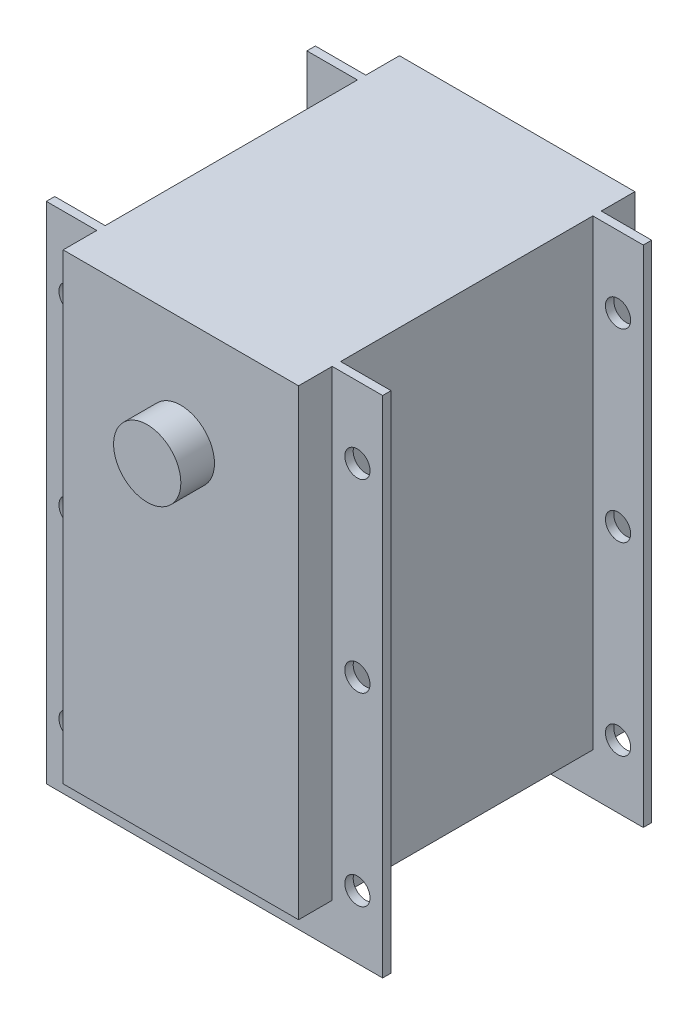
ISO-10303-21;
HEADER;
FILE_DESCRIPTION(('STEP AP214'),'2;1');
FILE_NAME('part.step','',(''),(''),'','','');
FILE_SCHEMA(('AUTOMOTIVE_DESIGN { 1 0 10303 214 1 1 1 1 }'));
ENDSEC;
DATA;
#1=APPLICATION_CONTEXT('core data for automotive mechanical design processes');
#2=APPLICATION_PROTOCOL_DEFINITION('international standard','automotive_design',2000,#1);
#3=PRODUCT_CONTEXT('',#1,'mechanical');
#4=PRODUCT('Part','Part','',(#3));
#5=PRODUCT_RELATED_PRODUCT_CATEGORY('part','',(#4));
#6=PRODUCT_DEFINITION_FORMATION('','',#4);
#7=PRODUCT_DEFINITION_CONTEXT('part definition',#1,'design');
#8=PRODUCT_DEFINITION('design','',#6,#7);
#9=PRODUCT_DEFINITION_SHAPE('','',#8);
#10=(LENGTH_UNIT() NAMED_UNIT(*) SI_UNIT(.MILLI.,.METRE.));
#11=(NAMED_UNIT(*) PLANE_ANGLE_UNIT() SI_UNIT($,.RADIAN.));
#12=(NAMED_UNIT(*) SI_UNIT($,.STERADIAN.) SOLID_ANGLE_UNIT());
#13=UNCERTAINTY_MEASURE_WITH_UNIT(LENGTH_MEASURE(1.E-05),#10,'distance_accuracy_value','');
#14=(GEOMETRIC_REPRESENTATION_CONTEXT(3) GLOBAL_UNCERTAINTY_ASSIGNED_CONTEXT((#13)) GLOBAL_UNIT_ASSIGNED_CONTEXT((#10,
#11,#12)) REPRESENTATION_CONTEXT('',''));
#15=CARTESIAN_POINT('',(0.,0.,0.));
#16=DIRECTION('',(0.,0.,1.));
#17=DIRECTION('',(1.,0.,0.));
#18=AXIS2_PLACEMENT_3D('',#15,#16,#17);
#19=CARTESIAN_POINT('',(-14.00000006,27.5,40.));
#20=DIRECTION('',(1.,0.,0.));
#21=DIRECTION('',(0.,1.,0.));
#22=AXIS2_PLACEMENT_3D('',#19,#20,#21);
#23=PLANE('',#22);
#24=DIRECTION('',(0.,1.,0.));
#25=VECTOR('',#24,1.);
#26=CARTESIAN_POINT('',(-14.00000006,27.5,5.));
#27=LINE('',#26,#25);
#28=CARTESIAN_POINT('',(-14.00000006,-27.5,5.));
#29=VERTEX_POINT('',#28);
#30=CARTESIAN_POINT('',(-14.00000006,27.5,5.));
#31=VERTEX_POINT('',#30);
#32=EDGE_CURVE('E229',#29,#31,#27,.T.);
#33=ORIENTED_EDGE('',*,*,#32,.F.);
#34=DIRECTION('',(0.,0.,-1.));
#35=VECTOR('',#34,1.);
#36=CARTESIAN_POINT('',(-14.00000006,-27.5,40.));
#37=LINE('',#36,#35);
#38=CARTESIAN_POINT('',(-14.00000006,-27.5,35.));
#39=VERTEX_POINT('',#38);
#40=EDGE_CURVE('E316',#39,#29,#37,.T.);
#41=ORIENTED_EDGE('',*,*,#40,.F.);
#42=DIRECTION('',(0.,-1.,0.));
#43=VECTOR('',#42,1.);
#44=CARTESIAN_POINT('',(-14.00000006,27.5,35.));
#45=LINE('',#44,#43);
#46=CARTESIAN_POINT('',(-14.00000006,27.5,35.));
#47=VERTEX_POINT('',#46);
#48=EDGE_CURVE('E275',#47,#39,#45,.T.);
#49=ORIENTED_EDGE('',*,*,#48,.F.);
#50=DIRECTION('',(0.,0.,-1.));
#51=VECTOR('',#50,1.);
#52=CARTESIAN_POINT('',(-14.00000006,27.5,40.));
#53=LINE('',#52,#51);
#54=EDGE_CURVE('E303',#47,#31,#53,.T.);
#55=ORIENTED_EDGE('',*,*,#54,.T.);
#56=EDGE_LOOP('',(#33,#41,#49,#55));
#57=FACE_BOUND('',#56,.T.);
#58=ADVANCED_FACE('F33',(#57),#23,.F.);
#59=CARTESIAN_POINT('',(-14.00000006,-27.5,40.));
#60=DIRECTION('',(0.,1.,0.));
#61=DIRECTION('',(0.,0.,1.));
#62=AXIS2_PLACEMENT_3D('',#59,#60,#61);
#63=PLANE('',#62);
#64=DIRECTION('',(-1.,0.,0.));
#65=VECTOR('',#64,1.);
#66=CARTESIAN_POINT('',(-14.00000006,-27.5,5.));
#67=LINE('',#66,#65);
#68=CARTESIAN_POINT('',(13.99999994,-27.5,5.));
#69=VERTEX_POINT('',#68);
#70=EDGE_CURVE('E227',#69,#29,#67,.T.);
#71=ORIENTED_EDGE('',*,*,#70,.F.);
#72=DIRECTION('',(0.,0.,-1.));
#73=VECTOR('',#72,1.);
#74=CARTESIAN_POINT('',(13.99999994,-27.5,40.));
#75=LINE('',#74,#73);
#76=CARTESIAN_POINT('',(13.99999994,-27.5,35.));
#77=VERTEX_POINT('',#76);
#78=EDGE_CURVE('E313',#77,#69,#75,.T.);
#79=ORIENTED_EDGE('',*,*,#78,.F.);
#80=DIRECTION('',(1.,0.,0.));
#81=VECTOR('',#80,1.);
#82=CARTESIAN_POINT('',(-14.00000006,-27.5,35.));
#83=LINE('',#82,#81);
#84=EDGE_CURVE('E273',#39,#77,#83,.T.);
#85=ORIENTED_EDGE('',*,*,#84,.F.);
#86=ORIENTED_EDGE('',*,*,#40,.T.);
#87=EDGE_LOOP('',(#71,#79,#85,#86));
#88=FACE_BOUND('',#87,.T.);
#89=ADVANCED_FACE('F416',(#88),#63,.F.);
#90=CARTESIAN_POINT('',(13.99999994,27.5,40.));
#91=DIRECTION('',(-1.,0.,0.));
#92=DIRECTION('',(0.,-1.,0.));
#93=AXIS2_PLACEMENT_3D('',#90,#91,#92);
#94=PLANE('',#93);
#95=DIRECTION('',(0.,-1.,0.));
#96=VECTOR('',#95,1.);
#97=CARTESIAN_POINT('',(13.99999994,27.5,5.));
#98=LINE('',#97,#96);
#99=CARTESIAN_POINT('',(13.99999994,27.5,5.));
#100=VERTEX_POINT('',#99);
#101=EDGE_CURVE('E225',#100,#69,#98,.T.);
#102=ORIENTED_EDGE('',*,*,#101,.F.);
#103=DIRECTION('',(0.,0.,-1.));
#104=VECTOR('',#103,1.);
#105=CARTESIAN_POINT('',(13.99999994,27.5,40.));
#106=LINE('',#105,#104);
#107=CARTESIAN_POINT('',(13.99999994,27.5,35.));
#108=VERTEX_POINT('',#107);
#109=EDGE_CURVE('E308',#108,#100,#106,.T.);
#110=ORIENTED_EDGE('',*,*,#109,.F.);
#111=DIRECTION('',(0.,1.,0.));
#112=VECTOR('',#111,1.);
#113=CARTESIAN_POINT('',(13.99999994,27.5,35.));
#114=LINE('',#113,#112);
#115=EDGE_CURVE('E271',#77,#108,#114,.T.);
#116=ORIENTED_EDGE('',*,*,#115,.F.);
#117=ORIENTED_EDGE('',*,*,#78,.T.);
#118=EDGE_LOOP('',(#102,#110,#116,#117));
#119=FACE_BOUND('',#118,.T.);
#120=ADVANCED_FACE('F422',(#119),#94,.F.);
#121=CARTESIAN_POINT('',(-14.00000006,-27.5,4.));
#122=VERTEX_POINT('',#121);
#123=CARTESIAN_POINT('',(-14.00000006,-27.5,0.));
#124=VERTEX_POINT('',#123);
#125=EDGE_CURVE('E312',#122,#124,#37,.T.);
#126=ORIENTED_EDGE('',*,*,#125,.F.);
#127=DIRECTION('',(0.,1.,0.));
#128=VECTOR('',#127,1.);
#129=CARTESIAN_POINT('',(-14.00000006,27.5,4.));
#130=LINE('',#129,#128);
#131=CARTESIAN_POINT('',(-14.00000006,27.5,4.));
#132=VERTEX_POINT('',#131);
#133=EDGE_CURVE('E222',#122,#132,#130,.T.);
#134=ORIENTED_EDGE('',*,*,#133,.T.);
#135=CARTESIAN_POINT('',(-14.00000006,27.5,0.));
#136=VERTEX_POINT('',#135);
#137=EDGE_CURVE('E288',#132,#136,#53,.T.);
#138=ORIENTED_EDGE('',*,*,#137,.T.);
#139=DIRECTION('',(0.,-1.,0.));
#140=VECTOR('',#139,1.);
#141=CARTESIAN_POINT('',(-14.00000006,27.5,0.));
#142=LINE('',#141,#140);
#143=EDGE_CURVE('E277',#136,#124,#142,.T.);
#144=ORIENTED_EDGE('',*,*,#143,.T.);
#145=EDGE_LOOP('',(#126,#134,#138,#144));
#146=FACE_BOUND('',#145,.T.);
#147=ADVANCED_FACE('F418',(#146),#23,.F.);
#148=CARTESIAN_POINT('',(13.99999994,-27.5,4.));
#149=VERTEX_POINT('',#148);
#150=CARTESIAN_POINT('',(13.99999994,-27.5,0.));
#151=VERTEX_POINT('',#150);
#152=EDGE_CURVE('E307',#149,#151,#75,.T.);
#153=ORIENTED_EDGE('',*,*,#152,.F.);
#154=DIRECTION('',(-1.,0.,0.));
#155=VECTOR('',#154,1.);
#156=CARTESIAN_POINT('',(-14.00000006,-27.5,4.));
#157=LINE('',#156,#155);
#158=EDGE_CURVE('E48',#149,#122,#157,.T.);
#159=ORIENTED_EDGE('',*,*,#158,.T.);
#160=ORIENTED_EDGE('',*,*,#125,.T.);
#161=DIRECTION('',(1.,0.,0.));
#162=VECTOR('',#161,1.);
#163=CARTESIAN_POINT('',(-14.00000006,-27.5,0.));
#164=LINE('',#163,#162);
#165=EDGE_CURVE('E291',#124,#151,#164,.T.);
#166=ORIENTED_EDGE('',*,*,#165,.T.);
#167=EDGE_LOOP('',(#153,#159,#160,#166));
#168=FACE_BOUND('',#167,.T.);
#169=ADVANCED_FACE('F424',(#168),#63,.F.);
#170=CARTESIAN_POINT('',(13.99999994,27.5,4.));
#171=VERTEX_POINT('',#170);
#172=CARTESIAN_POINT('',(13.99999994,27.5,0.));
#173=VERTEX_POINT('',#172);
#174=EDGE_CURVE('E302',#171,#173,#106,.T.);
#175=ORIENTED_EDGE('',*,*,#174,.F.);
#176=DIRECTION('',(0.,-1.,0.));
#177=VECTOR('',#176,1.);
#178=CARTESIAN_POINT('',(13.99999994,27.5,4.));
#179=LINE('',#178,#177);
#180=EDGE_CURVE('E216',#171,#149,#179,.T.);
#181=ORIENTED_EDGE('',*,*,#180,.T.);
#182=ORIENTED_EDGE('',*,*,#152,.T.);
#183=DIRECTION('',(0.,1.,0.));
#184=VECTOR('',#183,1.);
#185=CARTESIAN_POINT('',(13.99999994,27.5,0.));
#186=LINE('',#185,#184);
#187=EDGE_CURVE('E294',#151,#173,#186,.T.);
#188=ORIENTED_EDGE('',*,*,#187,.T.);
#189=EDGE_LOOP('',(#175,#181,#182,#188));
#190=FACE_BOUND('',#189,.T.);
#191=ADVANCED_FACE('F430',(#190),#94,.F.);
#192=CARTESIAN_POINT('',(-14.00000006,27.5,40.));
#193=VERTEX_POINT('',#192);
#194=CARTESIAN_POINT('',(-14.00000006,27.5,36.));
#195=VERTEX_POINT('',#194);
#196=EDGE_CURVE('E299',#193,#195,#53,.T.);
#197=ORIENTED_EDGE('',*,*,#196,.T.);
#198=DIRECTION('',(0.,-1.,0.));
#199=VECTOR('',#198,1.);
#200=CARTESIAN_POINT('',(-14.00000006,27.5,36.));
#201=LINE('',#200,#199);
#202=CARTESIAN_POINT('',(-14.00000006,-27.5,36.));
#203=VERTEX_POINT('',#202);
#204=EDGE_CURVE('E268',#195,#203,#201,.T.);
#205=ORIENTED_EDGE('',*,*,#204,.T.);
#206=CARTESIAN_POINT('',(-14.00000006,-27.5,40.));
#207=VERTEX_POINT('',#206);
#208=EDGE_CURVE('E41',#207,#203,#37,.T.);
#209=ORIENTED_EDGE('',*,*,#208,.F.);
#210=DIRECTION('',(0.,-1.,0.));
#211=VECTOR('',#210,1.);
#212=CARTESIAN_POINT('',(-14.00000006,27.5,40.));
#213=LINE('',#212,#211);
#214=EDGE_CURVE('E278',#193,#207,#213,.T.);
#215=ORIENTED_EDGE('',*,*,#214,.F.);
#216=EDGE_LOOP('',(#197,#205,#209,#215));
#217=FACE_BOUND('',#216,.T.);
#218=ADVANCED_FACE('F35',(#217),#23,.F.);
#219=ORIENTED_EDGE('',*,*,#208,.T.);
#220=DIRECTION('',(1.,0.,0.));
#221=VECTOR('',#220,1.);
#222=CARTESIAN_POINT('',(-14.00000006,-27.5,36.));
#223=LINE('',#222,#221);
#224=CARTESIAN_POINT('',(13.99999994,-27.5,36.));
#225=VERTEX_POINT('',#224);
#226=EDGE_CURVE('E265',#203,#225,#223,.T.);
#227=ORIENTED_EDGE('',*,*,#226,.T.);
#228=CARTESIAN_POINT('',(13.99999994,-27.5,40.));
#229=VERTEX_POINT('',#228);
#230=EDGE_CURVE('E309',#229,#225,#75,.T.);
#231=ORIENTED_EDGE('',*,*,#230,.F.);
#232=DIRECTION('',(1.,0.,0.));
#233=VECTOR('',#232,1.);
#234=CARTESIAN_POINT('',(-14.00000006,-27.5,40.));
#235=LINE('',#234,#233);
#236=EDGE_CURVE('E281',#207,#229,#235,.T.);
#237=ORIENTED_EDGE('',*,*,#236,.F.);
#238=EDGE_LOOP('',(#219,#227,#231,#237));
#239=FACE_BOUND('',#238,.T.);
#240=ADVANCED_FACE('F425',(#239),#63,.F.);
#241=ORIENTED_EDGE('',*,*,#230,.T.);
#242=DIRECTION('',(0.,1.,0.));
#243=VECTOR('',#242,1.);
#244=CARTESIAN_POINT('',(13.99999994,27.5,36.));
#245=LINE('',#244,#243);
#246=CARTESIAN_POINT('',(13.99999994,27.5,36.));
#247=VERTEX_POINT('',#246);
#248=EDGE_CURVE('E258',#225,#247,#245,.T.);
#249=ORIENTED_EDGE('',*,*,#248,.T.);
#250=CARTESIAN_POINT('',(13.99999994,27.5,40.));
#251=VERTEX_POINT('',#250);
#252=EDGE_CURVE('E304',#251,#247,#106,.T.);
#253=ORIENTED_EDGE('',*,*,#252,.F.);
#254=DIRECTION('',(0.,1.,0.));
#255=VECTOR('',#254,1.);
#256=CARTESIAN_POINT('',(13.99999994,27.5,40.));
#257=LINE('',#256,#255);
#258=EDGE_CURVE('E284',#229,#251,#257,.T.);
#259=ORIENTED_EDGE('',*,*,#258,.F.);
#260=EDGE_LOOP('',(#241,#249,#253,#259));
#261=FACE_BOUND('',#260,.T.);
#262=ADVANCED_FACE('F436',(#261),#94,.F.);
#263=CARTESIAN_POINT('',(-14.00000006,27.5,40.));
#264=DIRECTION('',(0.,-1.,0.));
#265=DIRECTION('',(0.,0.,-1.));
#266=AXIS2_PLACEMENT_3D('',#263,#264,#265);
#267=PLANE('',#266);
#268=ORIENTED_EDGE('',*,*,#137,.F.);
#269=DIRECTION('',(1.,0.,0.));
#270=VECTOR('',#269,1.);
#271=CARTESIAN_POINT('',(20.,27.5,4.));
#272=LINE('',#271,#270);
#273=CARTESIAN_POINT('',(-20.,27.5,4.));
#274=VERTEX_POINT('',#273);
#275=EDGE_CURVE('E197',#274,#132,#272,.T.);
#276=ORIENTED_EDGE('',*,*,#275,.F.);
#277=DIRECTION('',(0.,0.,-1.));
#278=VECTOR('',#277,1.);
#279=CARTESIAN_POINT('',(-20.,27.5,5.));
#280=LINE('',#279,#278);
#281=CARTESIAN_POINT('',(-20.,27.5,5.));
#282=VERTEX_POINT('',#281);
#283=EDGE_CURVE('E217',#282,#274,#280,.T.);
#284=ORIENTED_EDGE('',*,*,#283,.F.);
#285=DIRECTION('',(1.,0.,0.));
#286=VECTOR('',#285,1.);
#287=CARTESIAN_POINT('',(20.,27.5,5.));
#288=LINE('',#287,#286);
#289=EDGE_CURVE('E182',#282,#31,#288,.T.);
#290=ORIENTED_EDGE('',*,*,#289,.T.);
#291=ORIENTED_EDGE('',*,*,#54,.F.);
#292=DIRECTION('',(-1.,0.,0.));
#293=VECTOR('',#292,1.);
#294=CARTESIAN_POINT('',(-20.,27.5,35.));
#295=LINE('',#294,#293);
#296=CARTESIAN_POINT('',(-20.,27.5,35.));
#297=VERTEX_POINT('',#296);
#298=EDGE_CURVE('E241',#47,#297,#295,.T.);
#299=ORIENTED_EDGE('',*,*,#298,.T.);
#300=DIRECTION('',(0.,0.,1.));
#301=VECTOR('',#300,1.);
#302=CARTESIAN_POINT('',(-20.,27.5,35.));
#303=LINE('',#302,#301);
#304=CARTESIAN_POINT('',(-20.,27.5,36.));
#305=VERTEX_POINT('',#304);
#306=EDGE_CURVE('E255',#297,#305,#303,.T.);
#307=ORIENTED_EDGE('',*,*,#306,.T.);
#308=DIRECTION('',(-1.,0.,0.));
#309=VECTOR('',#308,1.);
#310=CARTESIAN_POINT('',(-20.,27.5,36.));
#311=LINE('',#310,#309);
#312=EDGE_CURVE('E253',#195,#305,#311,.T.);
#313=ORIENTED_EDGE('',*,*,#312,.F.);
#314=ORIENTED_EDGE('',*,*,#196,.F.);
#315=DIRECTION('',(-1.,0.,0.));
#316=VECTOR('',#315,1.);
#317=CARTESIAN_POINT('',(-14.00000006,27.5,40.));
#318=LINE('',#317,#316);
#319=EDGE_CURVE('E286',#251,#193,#318,.T.);
#320=ORIENTED_EDGE('',*,*,#319,.F.);
#321=ORIENTED_EDGE('',*,*,#252,.T.);
#322=CARTESIAN_POINT('',(20.,27.5,36.));
#323=VERTEX_POINT('',#322);
#324=EDGE_CURVE('E56',#323,#247,#311,.T.);
#325=ORIENTED_EDGE('',*,*,#324,.F.);
#326=DIRECTION('',(0.,0.,1.));
#327=VECTOR('',#326,1.);
#328=CARTESIAN_POINT('',(20.,27.5,35.));
#329=LINE('',#328,#327);
#330=CARTESIAN_POINT('',(20.,27.5,35.));
#331=VERTEX_POINT('',#330);
#332=EDGE_CURVE('E259',#331,#323,#329,.T.);
#333=ORIENTED_EDGE('',*,*,#332,.F.);
#334=EDGE_CURVE('E242',#331,#108,#295,.T.);
#335=ORIENTED_EDGE('',*,*,#334,.T.);
#336=ORIENTED_EDGE('',*,*,#109,.T.);
#337=CARTESIAN_POINT('',(20.,27.5,5.));
#338=VERTEX_POINT('',#337);
#339=EDGE_CURVE('E206',#100,#338,#288,.T.);
#340=ORIENTED_EDGE('',*,*,#339,.T.);
#341=DIRECTION('',(0.,0.,-1.));
#342=VECTOR('',#341,1.);
#343=CARTESIAN_POINT('',(20.,27.5,5.));
#344=LINE('',#343,#342);
#345=CARTESIAN_POINT('',(20.,27.5,4.));
#346=VERTEX_POINT('',#345);
#347=EDGE_CURVE('E196',#338,#346,#344,.T.);
#348=ORIENTED_EDGE('',*,*,#347,.T.);
#349=EDGE_CURVE('E199',#171,#346,#272,.T.);
#350=ORIENTED_EDGE('',*,*,#349,.F.);
#351=ORIENTED_EDGE('',*,*,#174,.T.);
#352=DIRECTION('',(-1.,0.,0.));
#353=VECTOR('',#352,1.);
#354=CARTESIAN_POINT('',(-14.00000006,27.5,0.));
#355=LINE('',#354,#353);
#356=EDGE_CURVE('E282',#173,#136,#355,.T.);
#357=ORIENTED_EDGE('',*,*,#356,.T.);
#358=EDGE_LOOP('',(#268,#276,#284,#290,#291,#299,#307,#313,#314,#320,#321,#325,#333,#335,#336,
#340,#348,#350,#351,#357));
#359=FACE_BOUND('',#358,.T.);
#360=ADVANCED_FACE('F447',(#359),#267,.F.);
#361=CARTESIAN_POINT('',(0.,0.,40.));
#362=DIRECTION('',(0.,0.,1.));
#363=DIRECTION('',(1.,0.,0.));
#364=AXIS2_PLACEMENT_3D('',#361,#362,#363);
#365=PLANE('',#364);
#366=CARTESIAN_POINT('',(0.,14.5,40.));
#367=DIRECTION('',(0.,0.,1.));
#368=DIRECTION('',(1.,0.,0.));
#369=AXIS2_PLACEMENT_3D('',#366,#367,#368);
#370=CIRCLE('',#369,4.);
#371=CARTESIAN_POINT('',(4.,14.5,40.));
#372=VERTEX_POINT('',#371);
#373=EDGE_CURVE('E356',#372,#372,#370,.T.);
#374=ORIENTED_EDGE('',*,*,#373,.F.);
#375=EDGE_LOOP('',(#374));
#376=FACE_BOUND('',#375,.T.);
#377=ORIENTED_EDGE('',*,*,#214,.T.);
#378=ORIENTED_EDGE('',*,*,#236,.T.);
#379=ORIENTED_EDGE('',*,*,#258,.T.);
#380=ORIENTED_EDGE('',*,*,#319,.T.);
#381=EDGE_LOOP('',(#377,#378,#379,#380));
#382=FACE_BOUND('',#381,.T.);
#383=ADVANCED_FACE('F456',(#376,#382),#365,.T.);
#384=CARTESIAN_POINT('',(0.,0.,0.));
#385=DIRECTION('',(0.,0.,1.));
#386=DIRECTION('',(1.,0.,0.));
#387=AXIS2_PLACEMENT_3D('',#384,#385,#386);
#388=PLANE('',#387);
#389=CARTESIAN_POINT('',(0.,13.5,0.));
#390=DIRECTION('',(0.,0.,1.));
#391=DIRECTION('',(1.,0.,0.));
#392=AXIS2_PLACEMENT_3D('',#389,#390,#391);
#393=CIRCLE('',#392,3.5);
#394=CARTESIAN_POINT('',(3.5,13.5,0.));
#395=VERTEX_POINT('',#394);
#396=EDGE_CURVE('E11',#395,#395,#393,.F.);
#397=ORIENTED_EDGE('',*,*,#396,.F.);
#398=EDGE_LOOP('',(#397));
#399=FACE_BOUND('',#398,.T.);
#400=ORIENTED_EDGE('',*,*,#143,.F.);
#401=ORIENTED_EDGE('',*,*,#356,.F.);
#402=ORIENTED_EDGE('',*,*,#187,.F.);
#403=ORIENTED_EDGE('',*,*,#165,.F.);
#404=EDGE_LOOP('',(#400,#401,#402,#403));
#405=FACE_BOUND('',#404,.T.);
#406=ADVANCED_FACE('F458',(#399,#405),#388,.F.);
#407=CARTESIAN_POINT('',(0.,0.,35.));
#408=DIRECTION('',(0.,0.,1.));
#409=DIRECTION('',(1.,0.,0.));
#410=AXIS2_PLACEMENT_3D('',#407,#408,#409);
#411=PLANE('',#410);
#412=CARTESIAN_POINT('',(-17.,-25.,35.));
#413=DIRECTION('',(0.,0.,1.));
#414=DIRECTION('',(1.,0.,0.));
#415=AXIS2_PLACEMENT_3D('',#412,#413,#414);
#416=CIRCLE('',#415,1.5);
#417=CARTESIAN_POINT('',(-15.5,-25.,35.));
#418=VERTEX_POINT('',#417);
#419=EDGE_CURVE('E348',#418,#418,#416,.T.);
#420=ORIENTED_EDGE('',*,*,#419,.T.);
#421=EDGE_LOOP('',(#420));
#422=FACE_BOUND('',#421,.T.);
#423=CARTESIAN_POINT('',(17.,-25.000000066,35.));
#424=DIRECTION('',(0.,0.,1.));
#425=DIRECTION('',(1.,0.,0.));
#426=AXIS2_PLACEMENT_3D('',#423,#424,#425);
#427=CIRCLE('',#426,1.5);
#428=CARTESIAN_POINT('',(18.5,-25.000000066,35.));
#429=VERTEX_POINT('',#428);
#430=EDGE_CURVE('E366',#429,#429,#427,.T.);
#431=ORIENTED_EDGE('',*,*,#430,.T.);
#432=EDGE_LOOP('',(#431));
#433=FACE_BOUND('',#432,.T.);
#434=CARTESIAN_POINT('',(17.,-3.000000066,35.));
#435=DIRECTION('',(0.,0.,1.));
#436=DIRECTION('',(1.,0.,0.));
#437=AXIS2_PLACEMENT_3D('',#434,#435,#436);
#438=CIRCLE('',#437,1.5);
#439=CARTESIAN_POINT('',(18.5,-3.000000066,35.));
#440=VERTEX_POINT('',#439);
#441=EDGE_CURVE('E373',#440,#440,#438,.T.);
#442=ORIENTED_EDGE('',*,*,#441,.T.);
#443=EDGE_LOOP('',(#442));
#444=FACE_BOUND('',#443,.T.);
#445=CARTESIAN_POINT('',(-17.,-2.99999999999999,35.));
#446=DIRECTION('',(0.,0.,1.));
#447=DIRECTION('',(1.,0.,0.));
#448=AXIS2_PLACEMENT_3D('',#445,#446,#447);
#449=CIRCLE('',#448,1.5);
#450=CARTESIAN_POINT('',(-15.5,-2.99999999999999,35.));
#451=VERTEX_POINT('',#450);
#452=EDGE_CURVE('E380',#451,#451,#449,.T.);
#453=ORIENTED_EDGE('',*,*,#452,.T.);
#454=EDGE_LOOP('',(#453));
#455=FACE_BOUND('',#454,.T.);
#456=CARTESIAN_POINT('',(17.,18.999999934,35.));
#457=DIRECTION('',(0.,0.,1.));
#458=DIRECTION('',(1.,0.,0.));
#459=AXIS2_PLACEMENT_3D('',#456,#457,#458);
#460=CIRCLE('',#459,1.5);
#461=CARTESIAN_POINT('',(18.5,18.999999934,35.));
#462=VERTEX_POINT('',#461);
#463=EDGE_CURVE('E387',#462,#462,#460,.T.);
#464=ORIENTED_EDGE('',*,*,#463,.T.);
#465=EDGE_LOOP('',(#464));
#466=FACE_BOUND('',#465,.T.);
#467=CARTESIAN_POINT('',(-17.,19.,35.));
#468=DIRECTION('',(0.,0.,1.));
#469=DIRECTION('',(1.,0.,0.));
#470=AXIS2_PLACEMENT_3D('',#467,#468,#469);
#471=CIRCLE('',#470,1.5);
#472=CARTESIAN_POINT('',(-15.5,19.,35.));
#473=VERTEX_POINT('',#472);
#474=EDGE_CURVE('E202',#473,#473,#471,.T.);
#475=ORIENTED_EDGE('',*,*,#474,.T.);
#476=EDGE_LOOP('',(#475));
#477=FACE_BOUND('',#476,.T.);
#478=ORIENTED_EDGE('',*,*,#298,.F.);
#479=ORIENTED_EDGE('',*,*,#48,.T.);
#480=ORIENTED_EDGE('',*,*,#84,.T.);
#481=ORIENTED_EDGE('',*,*,#115,.T.);
#482=ORIENTED_EDGE('',*,*,#334,.F.);
#483=DIRECTION('',(0.,1.,0.));
#484=VECTOR('',#483,1.);
#485=CARTESIAN_POINT('',(20.,27.5,35.));
#486=LINE('',#485,#484);
#487=CARTESIAN_POINT('',(20.,-32.5,35.));
#488=VERTEX_POINT('',#487);
#489=EDGE_CURVE('E238',#488,#331,#486,.T.);
#490=ORIENTED_EDGE('',*,*,#489,.F.);
#491=DIRECTION('',(1.,0.,0.));
#492=VECTOR('',#491,1.);
#493=CARTESIAN_POINT('',(-20.,-32.5,35.));
#494=LINE('',#493,#492);
#495=CARTESIAN_POINT('',(-20.,-32.5,35.));
#496=VERTEX_POINT('',#495);
#497=EDGE_CURVE('E235',#496,#488,#494,.T.);
#498=ORIENTED_EDGE('',*,*,#497,.F.);
#499=DIRECTION('',(0.,-1.,0.));
#500=VECTOR('',#499,1.);
#501=CARTESIAN_POINT('',(-20.,27.5,35.));
#502=LINE('',#501,#500);
#503=EDGE_CURVE('E232',#297,#496,#502,.T.);
#504=ORIENTED_EDGE('',*,*,#503,.F.);
#505=EDGE_LOOP('',(#478,#479,#480,#481,#482,#490,#498,#504));
#506=FACE_BOUND('',#505,.T.);
#507=ADVANCED_FACE('F397',(#422,#433,#444,#455,#466,#477,#506),#411,.F.);
#508=CARTESIAN_POINT('',(0.,0.,36.));
#509=DIRECTION('',(0.,0.,1.));
#510=DIRECTION('',(1.,0.,0.));
#511=AXIS2_PLACEMENT_3D('',#508,#509,#510);
#512=PLANE('',#511);
#513=CARTESIAN_POINT('',(-17.,-25.,36.));
#514=DIRECTION('',(0.,0.,1.));
#515=DIRECTION('',(1.,0.,0.));
#516=AXIS2_PLACEMENT_3D('',#513,#514,#515);
#517=CIRCLE('',#516,1.5);
#518=CARTESIAN_POINT('',(-15.5,-25.,36.));
#519=VERTEX_POINT('',#518);
#520=EDGE_CURVE('E344',#519,#519,#517,.T.);
#521=ORIENTED_EDGE('',*,*,#520,.F.);
#522=EDGE_LOOP('',(#521));
#523=FACE_BOUND('',#522,.T.);
#524=CARTESIAN_POINT('',(17.,-25.000000066,36.));
#525=DIRECTION('',(0.,0.,1.));
#526=DIRECTION('',(1.,0.,0.));
#527=AXIS2_PLACEMENT_3D('',#524,#525,#526);
#528=CIRCLE('',#527,1.5);
#529=CARTESIAN_POINT('',(18.5,-25.000000066,36.));
#530=VERTEX_POINT('',#529);
#531=EDGE_CURVE('E340',#530,#530,#528,.T.);
#532=ORIENTED_EDGE('',*,*,#531,.F.);
#533=EDGE_LOOP('',(#532));
#534=FACE_BOUND('',#533,.T.);
#535=CARTESIAN_POINT('',(17.,-3.000000066,36.));
#536=DIRECTION('',(0.,0.,1.));
#537=DIRECTION('',(1.,0.,0.));
#538=AXIS2_PLACEMENT_3D('',#535,#536,#537);
#539=CIRCLE('',#538,1.5);
#540=CARTESIAN_POINT('',(18.5,-3.000000066,36.));
#541=VERTEX_POINT('',#540);
#542=EDGE_CURVE('E336',#541,#541,#539,.T.);
#543=ORIENTED_EDGE('',*,*,#542,.F.);
#544=EDGE_LOOP('',(#543));
#545=FACE_BOUND('',#544,.T.);
#546=CARTESIAN_POINT('',(-17.,-2.99999999999999,36.));
#547=DIRECTION('',(0.,0.,1.));
#548=DIRECTION('',(1.,0.,0.));
#549=AXIS2_PLACEMENT_3D('',#546,#547,#548);
#550=CIRCLE('',#549,1.5);
#551=CARTESIAN_POINT('',(-15.5,-2.99999999999999,36.));
#552=VERTEX_POINT('',#551);
#553=EDGE_CURVE('E331',#552,#552,#550,.T.);
#554=ORIENTED_EDGE('',*,*,#553,.F.);
#555=EDGE_LOOP('',(#554));
#556=FACE_BOUND('',#555,.T.);
#557=CARTESIAN_POINT('',(17.,18.999999934,36.));
#558=DIRECTION('',(0.,0.,1.));
#559=DIRECTION('',(1.,0.,0.));
#560=AXIS2_PLACEMENT_3D('',#557,#558,#559);
#561=CIRCLE('',#560,1.5);
#562=CARTESIAN_POINT('',(18.5,18.999999934,36.));
#563=VERTEX_POINT('',#562);
#564=EDGE_CURVE('E326',#563,#563,#561,.T.);
#565=ORIENTED_EDGE('',*,*,#564,.F.);
#566=EDGE_LOOP('',(#565));
#567=FACE_BOUND('',#566,.T.);
#568=CARTESIAN_POINT('',(-17.,19.,36.));
#569=DIRECTION('',(0.,0.,1.));
#570=DIRECTION('',(1.,0.,0.));
#571=AXIS2_PLACEMENT_3D('',#568,#569,#570);
#572=CIRCLE('',#571,1.5);
#573=CARTESIAN_POINT('',(-15.5,19.,36.));
#574=VERTEX_POINT('',#573);
#575=EDGE_CURVE('E321',#574,#574,#572,.T.);
#576=ORIENTED_EDGE('',*,*,#575,.F.);
#577=EDGE_LOOP('',(#576));
#578=FACE_BOUND('',#577,.T.);
#579=ORIENTED_EDGE('',*,*,#204,.F.);
#580=ORIENTED_EDGE('',*,*,#312,.T.);
#581=DIRECTION('',(0.,-1.,0.));
#582=VECTOR('',#581,1.);
#583=CARTESIAN_POINT('',(-20.,27.5,36.));
#584=LINE('',#583,#582);
#585=CARTESIAN_POINT('',(-20.,-32.5,36.));
#586=VERTEX_POINT('',#585);
#587=EDGE_CURVE('E231',#305,#586,#584,.T.);
#588=ORIENTED_EDGE('',*,*,#587,.T.);
#589=DIRECTION('',(1.,0.,0.));
#590=VECTOR('',#589,1.);
#591=CARTESIAN_POINT('',(-20.,-32.5,36.));
#592=LINE('',#591,#590);
#593=CARTESIAN_POINT('',(20.,-32.5,36.));
#594=VERTEX_POINT('',#593);
#595=EDGE_CURVE('E248',#586,#594,#592,.T.);
#596=ORIENTED_EDGE('',*,*,#595,.T.);
#597=DIRECTION('',(0.,1.,0.));
#598=VECTOR('',#597,1.);
#599=CARTESIAN_POINT('',(20.,27.5,36.));
#600=LINE('',#599,#598);
#601=EDGE_CURVE('E251',#594,#323,#600,.T.);
#602=ORIENTED_EDGE('',*,*,#601,.T.);
#603=ORIENTED_EDGE('',*,*,#324,.T.);
#604=ORIENTED_EDGE('',*,*,#248,.F.);
#605=ORIENTED_EDGE('',*,*,#226,.F.);
#606=EDGE_LOOP('',(#579,#580,#588,#596,#602,#603,#604,#605));
#607=FACE_BOUND('',#606,.T.);
#608=ADVANCED_FACE('F450',(#523,#534,#545,#556,#567,#578,#607),#512,.T.);
#609=CARTESIAN_POINT('',(-20.,27.5,35.));
#610=DIRECTION('',(-1.,0.,0.));
#611=DIRECTION('',(0.,-1.,0.));
#612=AXIS2_PLACEMENT_3D('',#609,#610,#611);
#613=PLANE('',#612);
#614=ORIENTED_EDGE('',*,*,#587,.F.);
#615=ORIENTED_EDGE('',*,*,#306,.F.);
#616=ORIENTED_EDGE('',*,*,#503,.T.);
#617=DIRECTION('',(0.,0.,1.));
#618=VECTOR('',#617,1.);
#619=CARTESIAN_POINT('',(-20.,-32.5,35.));
#620=LINE('',#619,#618);
#621=EDGE_CURVE('E245',#496,#586,#620,.T.);
#622=ORIENTED_EDGE('',*,*,#621,.T.);
#623=EDGE_LOOP('',(#614,#615,#616,#622));
#624=FACE_BOUND('',#623,.T.);
#625=ADVANCED_FACE('F470',(#624),#613,.T.);
#626=CARTESIAN_POINT('',(20.,27.5,35.));
#627=DIRECTION('',(1.,0.,0.));
#628=DIRECTION('',(0.,1.,0.));
#629=AXIS2_PLACEMENT_3D('',#626,#627,#628);
#630=PLANE('',#629);
#631=ORIENTED_EDGE('',*,*,#601,.F.);
#632=DIRECTION('',(0.,0.,1.));
#633=VECTOR('',#632,1.);
#634=CARTESIAN_POINT('',(20.,-32.5,35.));
#635=LINE('',#634,#633);
#636=EDGE_CURVE('E261',#488,#594,#635,.T.);
#637=ORIENTED_EDGE('',*,*,#636,.F.);
#638=ORIENTED_EDGE('',*,*,#489,.T.);
#639=ORIENTED_EDGE('',*,*,#332,.T.);
#640=EDGE_LOOP('',(#631,#637,#638,#639));
#641=FACE_BOUND('',#640,.T.);
#642=ADVANCED_FACE('F771',(#641),#630,.T.);
#643=CARTESIAN_POINT('',(-20.,-32.5,35.));
#644=DIRECTION('',(0.,-1.,0.));
#645=DIRECTION('',(0.,0.,-1.));
#646=AXIS2_PLACEMENT_3D('',#643,#644,#645);
#647=PLANE('',#646);
#648=ORIENTED_EDGE('',*,*,#595,.F.);
#649=ORIENTED_EDGE('',*,*,#621,.F.);
#650=ORIENTED_EDGE('',*,*,#497,.T.);
#651=ORIENTED_EDGE('',*,*,#636,.T.);
#652=EDGE_LOOP('',(#648,#649,#650,#651));
#653=FACE_BOUND('',#652,.T.);
#654=ADVANCED_FACE('F581',(#653),#647,.T.);
#655=CARTESIAN_POINT('',(0.,0.,5.));
#656=DIRECTION('',(0.,0.,-1.));
#657=DIRECTION('',(-1.,0.,0.));
#658=AXIS2_PLACEMENT_3D('',#655,#656,#657);
#659=PLANE('',#658);
#660=CARTESIAN_POINT('',(-17.,-25.,5.));
#661=DIRECTION('',(0.,0.,-1.));
#662=DIRECTION('',(-1.,0.,0.));
#663=AXIS2_PLACEMENT_3D('',#660,#661,#662);
#664=CIRCLE('',#663,1.5);
#665=CARTESIAN_POINT('',(-18.5,-25.,5.));
#666=VERTEX_POINT('',#665);
#667=EDGE_CURVE('E343',#666,#666,#664,.T.);
#668=ORIENTED_EDGE('',*,*,#667,.T.);
#669=EDGE_LOOP('',(#668));
#670=FACE_BOUND('',#669,.T.);
#671=CARTESIAN_POINT('',(17.,-25.000000066,5.));
#672=DIRECTION('',(0.,0.,-1.));
#673=DIRECTION('',(-1.,0.,0.));
#674=AXIS2_PLACEMENT_3D('',#671,#672,#673);
#675=CIRCLE('',#674,1.5);
#676=CARTESIAN_POINT('',(15.5,-25.000000066,5.));
#677=VERTEX_POINT('',#676);
#678=EDGE_CURVE('E339',#677,#677,#675,.T.);
#679=ORIENTED_EDGE('',*,*,#678,.T.);
#680=EDGE_LOOP('',(#679));
#681=FACE_BOUND('',#680,.T.);
#682=CARTESIAN_POINT('',(17.,-3.000000066,5.));
#683=DIRECTION('',(0.,0.,-1.));
#684=DIRECTION('',(-1.,0.,0.));
#685=AXIS2_PLACEMENT_3D('',#682,#683,#684);
#686=CIRCLE('',#685,1.5);
#687=CARTESIAN_POINT('',(15.5,-3.000000066,5.));
#688=VERTEX_POINT('',#687);
#689=EDGE_CURVE('E335',#688,#688,#686,.T.);
#690=ORIENTED_EDGE('',*,*,#689,.T.);
#691=EDGE_LOOP('',(#690));
#692=FACE_BOUND('',#691,.T.);
#693=CARTESIAN_POINT('',(-17.,-2.99999999999999,5.));
#694=DIRECTION('',(0.,0.,-1.));
#695=DIRECTION('',(-1.,0.,0.));
#696=AXIS2_PLACEMENT_3D('',#693,#694,#695);
#697=CIRCLE('',#696,1.5);
#698=CARTESIAN_POINT('',(-18.5,-2.99999999999999,5.));
#699=VERTEX_POINT('',#698);
#700=EDGE_CURVE('E330',#699,#699,#697,.T.);
#701=ORIENTED_EDGE('',*,*,#700,.T.);
#702=EDGE_LOOP('',(#701));
#703=FACE_BOUND('',#702,.T.);
#704=CARTESIAN_POINT('',(17.,18.999999934,5.));
#705=DIRECTION('',(0.,0.,-1.));
#706=DIRECTION('',(-1.,0.,0.));
#707=AXIS2_PLACEMENT_3D('',#704,#705,#706);
#708=CIRCLE('',#707,1.5);
#709=CARTESIAN_POINT('',(15.5,18.999999934,5.));
#710=VERTEX_POINT('',#709);
#711=EDGE_CURVE('E325',#710,#710,#708,.T.);
#712=ORIENTED_EDGE('',*,*,#711,.T.);
#713=EDGE_LOOP('',(#712));
#714=FACE_BOUND('',#713,.T.);
#715=CARTESIAN_POINT('',(-17.,19.,5.));
#716=DIRECTION('',(0.,0.,-1.));
#717=DIRECTION('',(-1.,0.,0.));
#718=AXIS2_PLACEMENT_3D('',#715,#716,#717);
#719=CIRCLE('',#718,1.5);
#720=CARTESIAN_POINT('',(-18.5,19.,5.));
#721=VERTEX_POINT('',#720);
#722=EDGE_CURVE('E320',#721,#721,#719,.T.);
#723=ORIENTED_EDGE('',*,*,#722,.T.);
#724=EDGE_LOOP('',(#723));
#725=FACE_BOUND('',#724,.T.);
#726=ORIENTED_EDGE('',*,*,#70,.T.);
#727=ORIENTED_EDGE('',*,*,#32,.T.);
#728=ORIENTED_EDGE('',*,*,#289,.F.);
#729=DIRECTION('',(0.,1.,0.));
#730=VECTOR('',#729,1.);
#731=CARTESIAN_POINT('',(-20.,27.5,5.));
#732=LINE('',#731,#730);
#733=CARTESIAN_POINT('',(-20.,-32.5,5.));
#734=VERTEX_POINT('',#733);
#735=EDGE_CURVE('E191',#734,#282,#732,.T.);
#736=ORIENTED_EDGE('',*,*,#735,.F.);
#737=DIRECTION('',(-1.,0.,0.));
#738=VECTOR('',#737,1.);
#739=CARTESIAN_POINT('',(20.,-32.5,5.));
#740=LINE('',#739,#738);
#741=CARTESIAN_POINT('',(20.,-32.5,5.));
#742=VERTEX_POINT('',#741);
#743=EDGE_CURVE('E174',#742,#734,#740,.T.);
#744=ORIENTED_EDGE('',*,*,#743,.F.);
#745=DIRECTION('',(0.,-1.,0.));
#746=VECTOR('',#745,1.);
#747=CARTESIAN_POINT('',(20.,27.5,5.));
#748=LINE('',#747,#746);
#749=EDGE_CURVE('E188',#338,#742,#748,.T.);
#750=ORIENTED_EDGE('',*,*,#749,.F.);
#751=ORIENTED_EDGE('',*,*,#339,.F.);
#752=ORIENTED_EDGE('',*,*,#101,.T.);
#753=EDGE_LOOP('',(#726,#727,#728,#736,#744,#750,#751,#752));
#754=FACE_BOUND('',#753,.T.);
#755=ADVANCED_FACE('F187',(#670,#681,#692,#703,#714,#725,#754),#659,.F.);
#756=CARTESIAN_POINT('',(0.,0.,4.));
#757=DIRECTION('',(0.,0.,-1.));
#758=DIRECTION('',(-1.,0.,0.));
#759=AXIS2_PLACEMENT_3D('',#756,#757,#758);
#760=PLANE('',#759);
#761=CARTESIAN_POINT('',(-17.,-25.,4.));
#762=DIRECTION('',(0.,0.,-1.));
#763=DIRECTION('',(-1.,0.,0.));
#764=AXIS2_PLACEMENT_3D('',#761,#762,#763);
#765=CIRCLE('',#764,1.5);
#766=CARTESIAN_POINT('',(-18.5,-25.,4.));
#767=VERTEX_POINT('',#766);
#768=EDGE_CURVE('E341',#767,#767,#765,.T.);
#769=ORIENTED_EDGE('',*,*,#768,.F.);
#770=EDGE_LOOP('',(#769));
#771=FACE_BOUND('',#770,.T.);
#772=CARTESIAN_POINT('',(17.,-25.000000066,4.));
#773=DIRECTION('',(0.,0.,-1.));
#774=DIRECTION('',(-1.,0.,0.));
#775=AXIS2_PLACEMENT_3D('',#772,#773,#774);
#776=CIRCLE('',#775,1.5);
#777=CARTESIAN_POINT('',(15.5,-25.000000066,4.));
#778=VERTEX_POINT('',#777);
#779=EDGE_CURVE('E337',#778,#778,#776,.T.);
#780=ORIENTED_EDGE('',*,*,#779,.F.);
#781=EDGE_LOOP('',(#780));
#782=FACE_BOUND('',#781,.T.);
#783=CARTESIAN_POINT('',(17.,-3.000000066,4.));
#784=DIRECTION('',(0.,0.,-1.));
#785=DIRECTION('',(-1.,0.,0.));
#786=AXIS2_PLACEMENT_3D('',#783,#784,#785);
#787=CIRCLE('',#786,1.5);
#788=CARTESIAN_POINT('',(15.5,-3.000000066,4.));
#789=VERTEX_POINT('',#788);
#790=EDGE_CURVE('E332',#789,#789,#787,.T.);
#791=ORIENTED_EDGE('',*,*,#790,.F.);
#792=EDGE_LOOP('',(#791));
#793=FACE_BOUND('',#792,.T.);
#794=CARTESIAN_POINT('',(-17.,-2.99999999999999,4.));
#795=DIRECTION('',(0.,0.,-1.));
#796=DIRECTION('',(-1.,0.,0.));
#797=AXIS2_PLACEMENT_3D('',#794,#795,#796);
#798=CIRCLE('',#797,1.5);
#799=CARTESIAN_POINT('',(-18.5,-2.99999999999999,4.));
#800=VERTEX_POINT('',#799);
#801=EDGE_CURVE('E327',#800,#800,#798,.T.);
#802=ORIENTED_EDGE('',*,*,#801,.F.);
#803=EDGE_LOOP('',(#802));
#804=FACE_BOUND('',#803,.T.);
#805=CARTESIAN_POINT('',(17.,18.999999934,4.));
#806=DIRECTION('',(0.,0.,-1.));
#807=DIRECTION('',(-1.,0.,0.));
#808=AXIS2_PLACEMENT_3D('',#805,#806,#807);
#809=CIRCLE('',#808,1.5);
#810=CARTESIAN_POINT('',(15.5,18.999999934,4.));
#811=VERTEX_POINT('',#810);
#812=EDGE_CURVE('E322',#811,#811,#809,.T.);
#813=ORIENTED_EDGE('',*,*,#812,.F.);
#814=EDGE_LOOP('',(#813));
#815=FACE_BOUND('',#814,.T.);
#816=CARTESIAN_POINT('',(-17.,19.,4.));
#817=DIRECTION('',(0.,0.,-1.));
#818=DIRECTION('',(-1.,0.,0.));
#819=AXIS2_PLACEMENT_3D('',#816,#817,#818);
#820=CIRCLE('',#819,1.5);
#821=CARTESIAN_POINT('',(-18.5,19.,4.));
#822=VERTEX_POINT('',#821);
#823=EDGE_CURVE('E317',#822,#822,#820,.T.);
#824=ORIENTED_EDGE('',*,*,#823,.F.);
#825=EDGE_LOOP('',(#824));
#826=FACE_BOUND('',#825,.T.);
#827=ORIENTED_EDGE('',*,*,#133,.F.);
#828=ORIENTED_EDGE('',*,*,#158,.F.);
#829=ORIENTED_EDGE('',*,*,#180,.F.);
#830=ORIENTED_EDGE('',*,*,#349,.T.);
#831=DIRECTION('',(0.,-1.,0.));
#832=VECTOR('',#831,1.);
#833=CARTESIAN_POINT('',(20.,27.5,4.));
#834=LINE('',#833,#832);
#835=CARTESIAN_POINT('',(20.,-32.5,4.));
#836=VERTEX_POINT('',#835);
#837=EDGE_CURVE('E209',#346,#836,#834,.T.);
#838=ORIENTED_EDGE('',*,*,#837,.T.);
#839=DIRECTION('',(-1.,0.,0.));
#840=VECTOR('',#839,1.);
#841=CARTESIAN_POINT('',(20.,-32.5,4.));
#842=LINE('',#841,#840);
#843=CARTESIAN_POINT('',(-20.,-32.5,4.));
#844=VERTEX_POINT('',#843);
#845=EDGE_CURVE('E176',#836,#844,#842,.T.);
#846=ORIENTED_EDGE('',*,*,#845,.T.);
#847=DIRECTION('',(0.,1.,0.));
#848=VECTOR('',#847,1.);
#849=CARTESIAN_POINT('',(-20.,27.5,4.));
#850=LINE('',#849,#848);
#851=EDGE_CURVE('E212',#844,#274,#850,.T.);
#852=ORIENTED_EDGE('',*,*,#851,.T.);
#853=ORIENTED_EDGE('',*,*,#275,.T.);
#854=EDGE_LOOP('',(#827,#828,#829,#830,#838,#846,#852,#853));
#855=FACE_BOUND('',#854,.T.);
#856=ADVANCED_FACE('F533',(#771,#782,#793,#804,#815,#826,#855),#760,.T.);
#857=CARTESIAN_POINT('',(20.,27.5,5.));
#858=DIRECTION('',(1.,0.,0.));
#859=DIRECTION('',(0.,1.,0.));
#860=AXIS2_PLACEMENT_3D('',#857,#858,#859);
#861=PLANE('',#860);
#862=ORIENTED_EDGE('',*,*,#837,.F.);
#863=ORIENTED_EDGE('',*,*,#347,.F.);
#864=ORIENTED_EDGE('',*,*,#749,.T.);
#865=DIRECTION('',(0.,0.,-1.));
#866=VECTOR('',#865,1.);
#867=CARTESIAN_POINT('',(20.,-32.5,5.));
#868=LINE('',#867,#866);
#869=EDGE_CURVE('E171',#742,#836,#868,.T.);
#870=ORIENTED_EDGE('',*,*,#869,.T.);
#871=EDGE_LOOP('',(#862,#863,#864,#870));
#872=FACE_BOUND('',#871,.T.);
#873=ADVANCED_FACE('F194',(#872),#861,.T.);
#874=CARTESIAN_POINT('',(-20.,27.5,5.));
#875=DIRECTION('',(-1.,0.,0.));
#876=DIRECTION('',(0.,-1.,0.));
#877=AXIS2_PLACEMENT_3D('',#874,#875,#876);
#878=PLANE('',#877);
#879=ORIENTED_EDGE('',*,*,#851,.F.);
#880=DIRECTION('',(0.,0.,-1.));
#881=VECTOR('',#880,1.);
#882=CARTESIAN_POINT('',(-20.,-32.5,5.));
#883=LINE('',#882,#881);
#884=EDGE_CURVE('E181',#734,#844,#883,.T.);
#885=ORIENTED_EDGE('',*,*,#884,.F.);
#886=ORIENTED_EDGE('',*,*,#735,.T.);
#887=ORIENTED_EDGE('',*,*,#283,.T.);
#888=EDGE_LOOP('',(#879,#885,#886,#887));
#889=FACE_BOUND('',#888,.T.);
#890=ADVANCED_FACE('F532',(#889),#878,.T.);
#891=CARTESIAN_POINT('',(20.,-32.5,5.));
#892=DIRECTION('',(0.,-1.,0.));
#893=DIRECTION('',(0.,0.,-1.));
#894=AXIS2_PLACEMENT_3D('',#891,#892,#893);
#895=PLANE('',#894);
#896=ORIENTED_EDGE('',*,*,#845,.F.);
#897=ORIENTED_EDGE('',*,*,#869,.F.);
#898=ORIENTED_EDGE('',*,*,#743,.T.);
#899=ORIENTED_EDGE('',*,*,#884,.T.);
#900=EDGE_LOOP('',(#896,#897,#898,#899));
#901=FACE_BOUND('',#900,.T.);
#902=ADVANCED_FACE('F173',(#901),#895,.T.);
#903=CARTESIAN_POINT('',(-17.,19.,0.));
#904=DIRECTION('',(0.,0.,1.));
#905=DIRECTION('',(1.,0.,0.));
#906=AXIS2_PLACEMENT_3D('',#903,#904,#905);
#907=CYLINDRICAL_SURFACE('',#906,1.5);
#908=ORIENTED_EDGE('',*,*,#823,.T.);
#909=EDGE_LOOP('',(#908));
#910=FACE_BOUND('',#909,.T.);
#911=ORIENTED_EDGE('',*,*,#722,.F.);
#912=EDGE_LOOP('',(#911));
#913=FACE_BOUND('',#912,.T.);
#914=ADVANCED_FACE('F403',(#910,#913),#907,.F.);
#915=ORIENTED_EDGE('',*,*,#575,.T.);
#916=EDGE_LOOP('',(#915));
#917=FACE_BOUND('',#916,.T.);
#918=ORIENTED_EDGE('',*,*,#474,.F.);
#919=EDGE_LOOP('',(#918));
#920=FACE_BOUND('',#919,.T.);
#921=ADVANCED_FACE('F400',(#917,#920),#907,.F.);
#922=CARTESIAN_POINT('',(17.,18.999999934,0.));
#923=DIRECTION('',(0.,0.,1.));
#924=DIRECTION('',(1.,0.,0.));
#925=AXIS2_PLACEMENT_3D('',#922,#923,#924);
#926=CYLINDRICAL_SURFACE('',#925,1.5);
#927=ORIENTED_EDGE('',*,*,#812,.T.);
#928=EDGE_LOOP('',(#927));
#929=FACE_BOUND('',#928,.T.);
#930=ORIENTED_EDGE('',*,*,#711,.F.);
#931=EDGE_LOOP('',(#930));
#932=FACE_BOUND('',#931,.T.);
#933=ADVANCED_FACE('F402',(#929,#932),#926,.F.);
#934=ORIENTED_EDGE('',*,*,#564,.T.);
#935=EDGE_LOOP('',(#934));
#936=FACE_BOUND('',#935,.T.);
#937=ORIENTED_EDGE('',*,*,#463,.F.);
#938=EDGE_LOOP('',(#937));
#939=FACE_BOUND('',#938,.T.);
#940=ADVANCED_FACE('F410',(#936,#939),#926,.F.);
#941=CARTESIAN_POINT('',(-17.,-2.99999999999999,0.));
#942=DIRECTION('',(0.,0.,1.));
#943=DIRECTION('',(1.,0.,0.));
#944=AXIS2_PLACEMENT_3D('',#941,#942,#943);
#945=CYLINDRICAL_SURFACE('',#944,1.5);
#946=ORIENTED_EDGE('',*,*,#801,.T.);
#947=EDGE_LOOP('',(#946));
#948=FACE_BOUND('',#947,.T.);
#949=ORIENTED_EDGE('',*,*,#700,.F.);
#950=EDGE_LOOP('',(#949));
#951=FACE_BOUND('',#950,.T.);
#952=ADVANCED_FACE('F613',(#948,#951),#945,.F.);
#953=ORIENTED_EDGE('',*,*,#553,.T.);
#954=EDGE_LOOP('',(#953));
#955=FACE_BOUND('',#954,.T.);
#956=ORIENTED_EDGE('',*,*,#452,.F.);
#957=EDGE_LOOP('',(#956));
#958=FACE_BOUND('',#957,.T.);
#959=ADVANCED_FACE('F622',(#955,#958),#945,.F.);
#960=CARTESIAN_POINT('',(17.,-3.000000066,0.));
#961=DIRECTION('',(0.,0.,1.));
#962=DIRECTION('',(1.,0.,0.));
#963=AXIS2_PLACEMENT_3D('',#960,#961,#962);
#964=CYLINDRICAL_SURFACE('',#963,1.5);
#965=ORIENTED_EDGE('',*,*,#790,.T.);
#966=EDGE_LOOP('',(#965));
#967=FACE_BOUND('',#966,.T.);
#968=ORIENTED_EDGE('',*,*,#689,.F.);
#969=EDGE_LOOP('',(#968));
#970=FACE_BOUND('',#969,.T.);
#971=ADVANCED_FACE('F632',(#967,#970),#964,.F.);
#972=ORIENTED_EDGE('',*,*,#542,.T.);
#973=EDGE_LOOP('',(#972));
#974=FACE_BOUND('',#973,.T.);
#975=ORIENTED_EDGE('',*,*,#441,.F.);
#976=EDGE_LOOP('',(#975));
#977=FACE_BOUND('',#976,.T.);
#978=ADVANCED_FACE('F641',(#974,#977),#964,.F.);
#979=CARTESIAN_POINT('',(17.,-25.000000066,0.));
#980=DIRECTION('',(0.,0.,1.));
#981=DIRECTION('',(1.,0.,0.));
#982=AXIS2_PLACEMENT_3D('',#979,#980,#981);
#983=CYLINDRICAL_SURFACE('',#982,1.5);
#984=ORIENTED_EDGE('',*,*,#779,.T.);
#985=EDGE_LOOP('',(#984));
#986=FACE_BOUND('',#985,.T.);
#987=ORIENTED_EDGE('',*,*,#678,.F.);
#988=EDGE_LOOP('',(#987));
#989=FACE_BOUND('',#988,.T.);
#990=ADVANCED_FACE('F651',(#986,#989),#983,.F.);
#991=ORIENTED_EDGE('',*,*,#531,.T.);
#992=EDGE_LOOP('',(#991));
#993=FACE_BOUND('',#992,.T.);
#994=ORIENTED_EDGE('',*,*,#430,.F.);
#995=EDGE_LOOP('',(#994));
#996=FACE_BOUND('',#995,.T.);
#997=ADVANCED_FACE('F660',(#993,#996),#983,.F.);
#998=CARTESIAN_POINT('',(-17.,-25.,0.));
#999=DIRECTION('',(0.,0.,1.));
#1000=DIRECTION('',(1.,0.,0.));
#1001=AXIS2_PLACEMENT_3D('',#998,#999,#1000);
#1002=CYLINDRICAL_SURFACE('',#1001,1.5);
#1003=ORIENTED_EDGE('',*,*,#768,.T.);
#1004=EDGE_LOOP('',(#1003));
#1005=FACE_BOUND('',#1004,.T.);
#1006=ORIENTED_EDGE('',*,*,#667,.F.);
#1007=EDGE_LOOP('',(#1006));
#1008=FACE_BOUND('',#1007,.T.);
#1009=ADVANCED_FACE('F670',(#1005,#1008),#1002,.F.);
#1010=ORIENTED_EDGE('',*,*,#520,.T.);
#1011=EDGE_LOOP('',(#1010));
#1012=FACE_BOUND('',#1011,.T.);
#1013=ORIENTED_EDGE('',*,*,#419,.F.);
#1014=EDGE_LOOP('',(#1013));
#1015=FACE_BOUND('',#1014,.T.);
#1016=ADVANCED_FACE('F679',(#1012,#1015),#1002,.F.);
#1017=CARTESIAN_POINT('',(0.,14.5,44.));
#1018=DIRECTION('',(0.,0.,-1.));
#1019=DIRECTION('',(-1.,0.,0.));
#1020=AXIS2_PLACEMENT_3D('',#1017,#1018,#1019);
#1021=CYLINDRICAL_SURFACE('',#1020,4.);
#1022=CARTESIAN_POINT('',(0.,14.5,44.));
#1023=DIRECTION('',(0.,0.,1.));
#1024=DIRECTION('',(1.,0.,0.));
#1025=AXIS2_PLACEMENT_3D('',#1022,#1023,#1024);
#1026=CIRCLE('',#1025,4.);
#1027=CARTESIAN_POINT('',(4.,14.5,44.));
#1028=VERTEX_POINT('',#1027);
#1029=EDGE_CURVE('E351',#1028,#1028,#1026,.T.);
#1030=ORIENTED_EDGE('',*,*,#1029,.F.);
#1031=EDGE_LOOP('',(#1030));
#1032=FACE_BOUND('',#1031,.T.);
#1033=ORIENTED_EDGE('',*,*,#373,.T.);
#1034=EDGE_LOOP('',(#1033));
#1035=FACE_BOUND('',#1034,.T.);
#1036=ADVANCED_FACE('F687',(#1032,#1035),#1021,.T.);
#1037=CARTESIAN_POINT('',(0.,14.5,44.));
#1038=DIRECTION('',(0.,0.,1.));
#1039=DIRECTION('',(1.,0.,0.));
#1040=AXIS2_PLACEMENT_3D('',#1037,#1038,#1039);
#1041=PLANE('',#1040);
#1042=ORIENTED_EDGE('',*,*,#1029,.T.);
#1043=EDGE_LOOP('',(#1042));
#1044=FACE_BOUND('',#1043,.T.);
#1045=ADVANCED_FACE('F701',(#1044),#1041,.T.);
#1046=CARTESIAN_POINT('',(0.,13.5,-1.));
#1047=DIRECTION('',(0.,0.,1.));
#1048=DIRECTION('',(1.,0.,0.));
#1049=AXIS2_PLACEMENT_3D('',#1046,#1047,#1048);
#1050=CYLINDRICAL_SURFACE('',#1049,3.5);
#1051=CARTESIAN_POINT('',(0.,13.5,-1.));
#1052=DIRECTION('',(0.,0.,-1.));
#1053=DIRECTION('',(-1.,0.,0.));
#1054=AXIS2_PLACEMENT_3D('',#1051,#1052,#1053);
#1055=CIRCLE('',#1054,3.5);
#1056=CARTESIAN_POINT('',(-3.5,13.5,-1.));
#1057=VERTEX_POINT('',#1056);
#1058=EDGE_CURVE('E742',#1057,#1057,#1055,.T.);
#1059=ORIENTED_EDGE('',*,*,#1058,.F.);
#1060=EDGE_LOOP('',(#1059));
#1061=FACE_BOUND('',#1060,.T.);
#1062=ORIENTED_EDGE('',*,*,#396,.T.);
#1063=EDGE_LOOP('',(#1062));
#1064=FACE_BOUND('',#1063,.T.);
#1065=ADVANCED_FACE('F711',(#1061,#1064),#1050,.T.);
#1066=CARTESIAN_POINT('',(0.,13.5,-1.));
#1067=DIRECTION('',(0.,0.,-1.));
#1068=DIRECTION('',(-1.,0.,0.));
#1069=AXIS2_PLACEMENT_3D('',#1066,#1067,#1068);
#1070=PLANE('',#1069);
#1071=ORIENTED_EDGE('',*,*,#1058,.T.);
#1072=EDGE_LOOP('',(#1071));
#1073=FACE_BOUND('',#1072,.T.);
#1074=ADVANCED_FACE('F726',(#1073),#1070,.T.);
#1075=CLOSED_SHELL('',(#58,#89,#120,#147,#169,#191,#218,#240,#262,#360,#383,#406,#507,#608,#625,
#642,#654,#755,#856,#873,#890,#902,#914,#921,#933,#940,#952,#959,#971,#978,#990,#997,#1009,
#1016,#1036,#1045,#1065,#1074));
#1076=MANIFOLD_SOLID_BREP('B2',#1075);
#1077=ADVANCED_BREP_SHAPE_REPRESENTATION('',(#18,#1076),#14);
#1078=SHAPE_DEFINITION_REPRESENTATION(#9,#1077);
ENDSEC;
END-ISO-10303-21;
